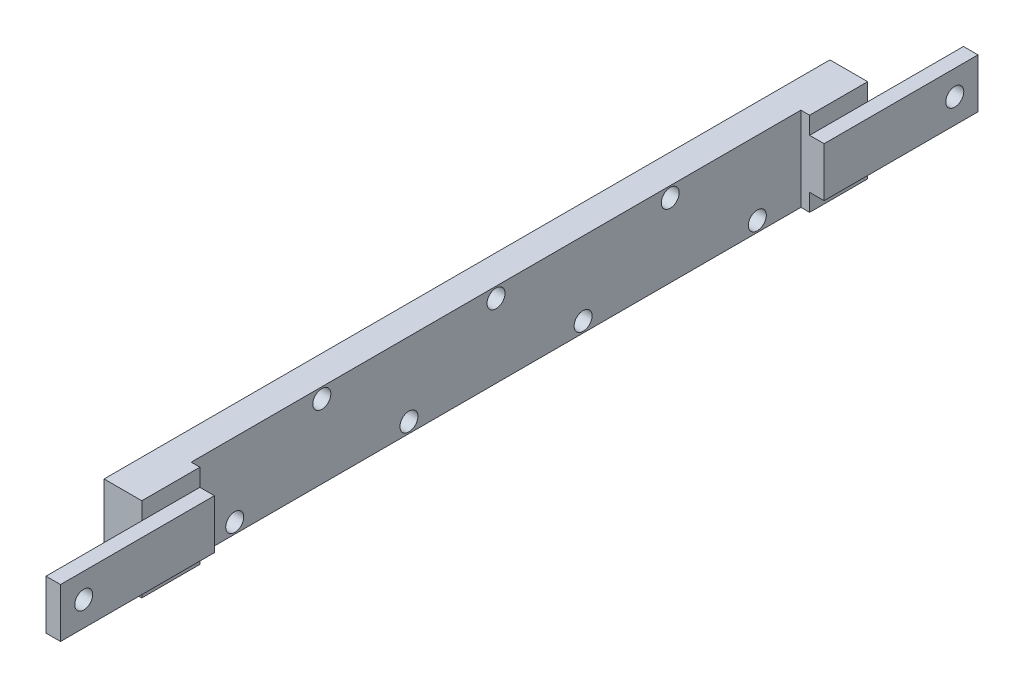
ISO-10303-21;
HEADER;
FILE_DESCRIPTION(('STEP AP214'),'2;1');
FILE_NAME('part.step','',(''),(''),'','','');
FILE_SCHEMA(('AUTOMOTIVE_DESIGN { 1 0 10303 214 1 1 1 1 }'));
ENDSEC;
DATA;
#1=APPLICATION_CONTEXT('core data for automotive mechanical design processes');
#2=APPLICATION_PROTOCOL_DEFINITION('international standard','automotive_design',2000,#1);
#3=PRODUCT_CONTEXT('',#1,'mechanical');
#4=PRODUCT('Part','Part','',(#3));
#5=PRODUCT_RELATED_PRODUCT_CATEGORY('part','',(#4));
#6=PRODUCT_DEFINITION_FORMATION('','',#4);
#7=PRODUCT_DEFINITION_CONTEXT('part definition',#1,'design');
#8=PRODUCT_DEFINITION('design','',#6,#7);
#9=PRODUCT_DEFINITION_SHAPE('','',#8);
#10=(LENGTH_UNIT() NAMED_UNIT(*) SI_UNIT(.MILLI.,.METRE.));
#11=(NAMED_UNIT(*) PLANE_ANGLE_UNIT() SI_UNIT($,.RADIAN.));
#12=(NAMED_UNIT(*) SI_UNIT($,.STERADIAN.) SOLID_ANGLE_UNIT());
#13=UNCERTAINTY_MEASURE_WITH_UNIT(LENGTH_MEASURE(1.E-05),#10,'distance_accuracy_value','');
#14=(GEOMETRIC_REPRESENTATION_CONTEXT(3) GLOBAL_UNCERTAINTY_ASSIGNED_CONTEXT((#13)) GLOBAL_UNIT_ASSIGNED_CONTEXT((#10,
#11,#12)) REPRESENTATION_CONTEXT('',''));
#15=CARTESIAN_POINT('',(0.,0.,0.));
#16=DIRECTION('',(0.,0.,1.));
#17=DIRECTION('',(1.,0.,0.));
#18=AXIS2_PLACEMENT_3D('',#15,#16,#17);
#19=CARTESIAN_POINT('',(13.,0.,0.));
#20=DIRECTION('',(-1.,0.,0.));
#21=DIRECTION('',(0.,0.,1.));
#22=AXIS2_PLACEMENT_3D('',#19,#20,#21);
#23=PLANE('',#22);
#24=DIRECTION('',(0.,0.,-1.));
#25=VECTOR('',#24,1.);
#26=CARTESIAN_POINT('',(13.,-8.5,-105.));
#27=LINE('',#26,#25);
#28=CARTESIAN_POINT('',(13.,-8.5,-105.));
#29=VERTEX_POINT('',#28);
#30=CARTESIAN_POINT('',(13.,-8.5,-125.));
#31=VERTEX_POINT('',#30);
#32=EDGE_CURVE('E346',#29,#31,#27,.T.);
#33=ORIENTED_EDGE('',*,*,#32,.F.);
#34=DIRECTION('',(0.,-1.,0.));
#35=VECTOR('',#34,1.);
#36=CARTESIAN_POINT('',(13.,14.5,-105.));
#37=LINE('',#36,#35);
#38=CARTESIAN_POINT('',(13.,-14.5,-105.));
#39=VERTEX_POINT('',#38);
#40=EDGE_CURVE('E219',#29,#39,#37,.T.);
#41=ORIENTED_EDGE('',*,*,#40,.T.);
#42=DIRECTION('',(0.,0.,-1.));
#43=VECTOR('',#42,1.);
#44=CARTESIAN_POINT('',(13.,-14.5,-105.));
#45=LINE('',#44,#43);
#46=CARTESIAN_POINT('',(13.,-14.5,-125.));
#47=VERTEX_POINT('',#46);
#48=EDGE_CURVE('E218',#39,#47,#45,.T.);
#49=ORIENTED_EDGE('',*,*,#48,.T.);
#50=DIRECTION('',(0.,-1.,0.));
#51=VECTOR('',#50,1.);
#52=CARTESIAN_POINT('',(13.,14.5,-125.));
#53=LINE('',#52,#51);
#54=EDGE_CURVE('E222',#31,#47,#53,.T.);
#55=ORIENTED_EDGE('',*,*,#54,.F.);
#56=EDGE_LOOP('',(#33,#41,#49,#55));
#57=FACE_BOUND('',#56,.T.);
#58=ADVANCED_FACE('F67',(#57),#23,.F.);
#59=CARTESIAN_POINT('',(13.,0.,0.));
#60=DIRECTION('',(-1.,0.,0.));
#61=DIRECTION('',(0.,0.,1.));
#62=AXIS2_PLACEMENT_3D('',#59,#60,#61);
#63=PLANE('',#62);
#64=DIRECTION('',(0.,0.,1.));
#65=VECTOR('',#64,1.);
#66=CARTESIAN_POINT('',(13.,8.5,105.));
#67=LINE('',#66,#65);
#68=CARTESIAN_POINT('',(13.,8.5,105.));
#69=VERTEX_POINT('',#68);
#70=CARTESIAN_POINT('',(13.,8.5,125.));
#71=VERTEX_POINT('',#70);
#72=EDGE_CURVE('E391',#69,#71,#67,.T.);
#73=ORIENTED_EDGE('',*,*,#72,.F.);
#74=DIRECTION('',(0.,-1.,0.));
#75=VECTOR('',#74,1.);
#76=CARTESIAN_POINT('',(13.,14.5,105.));
#77=LINE('',#76,#75);
#78=CARTESIAN_POINT('',(13.,14.5,105.));
#79=VERTEX_POINT('',#78);
#80=EDGE_CURVE('E238',#79,#69,#77,.T.);
#81=ORIENTED_EDGE('',*,*,#80,.F.);
#82=DIRECTION('',(0.,0.,-1.));
#83=VECTOR('',#82,1.);
#84=CARTESIAN_POINT('',(13.,14.5,125.));
#85=LINE('',#84,#83);
#86=CARTESIAN_POINT('',(13.,14.5,125.));
#87=VERTEX_POINT('',#86);
#88=EDGE_CURVE('E233',#87,#79,#85,.T.);
#89=ORIENTED_EDGE('',*,*,#88,.F.);
#90=DIRECTION('',(0.,-1.,0.));
#91=VECTOR('',#90,1.);
#92=CARTESIAN_POINT('',(13.,14.5,125.));
#93=LINE('',#92,#91);
#94=EDGE_CURVE('E245',#87,#71,#93,.T.);
#95=ORIENTED_EDGE('',*,*,#94,.T.);
#96=EDGE_LOOP('',(#73,#81,#89,#95));
#97=FACE_BOUND('',#96,.T.);
#98=ADVANCED_FACE('F379',(#97),#63,.F.);
#99=CARTESIAN_POINT('',(10.,0.,0.));
#100=DIRECTION('',(1.,0.,0.));
#101=DIRECTION('',(0.,0.,-1.));
#102=AXIS2_PLACEMENT_3D('',#99,#100,#101);
#103=PLANE('',#102);
#104=CARTESIAN_POINT('',(10.,-10.8586178819304,90.));
#105=DIRECTION('',(1.,0.,0.));
#106=DIRECTION('',(0.,0.,-1.));
#107=AXIS2_PLACEMENT_3D('',#104,#105,#106);
#108=CIRCLE('',#107,3.1);
#109=CARTESIAN_POINT('',(10.,-10.8586178819304,86.9));
#110=VERTEX_POINT('',#109);
#111=EDGE_CURVE('E256',#110,#110,#108,.T.);
#112=ORIENTED_EDGE('',*,*,#111,.F.);
#113=EDGE_LOOP('',(#112));
#114=FACE_BOUND('',#113,.T.);
#115=CARTESIAN_POINT('',(10.,10.8586178819304,60.));
#116=DIRECTION('',(1.,0.,0.));
#117=DIRECTION('',(0.,0.,-1.));
#118=AXIS2_PLACEMENT_3D('',#115,#116,#117);
#119=CIRCLE('',#118,3.1);
#120=CARTESIAN_POINT('',(10.,10.8586178819304,56.9));
#121=VERTEX_POINT('',#120);
#122=EDGE_CURVE('E254',#121,#121,#119,.T.);
#123=ORIENTED_EDGE('',*,*,#122,.F.);
#124=EDGE_LOOP('',(#123));
#125=FACE_BOUND('',#124,.T.);
#126=CARTESIAN_POINT('',(10.,10.8586178819304,0.));
#127=DIRECTION('',(1.,0.,0.));
#128=DIRECTION('',(0.,0.,-1.));
#129=AXIS2_PLACEMENT_3D('',#126,#127,#128);
#130=CIRCLE('',#129,3.1);
#131=CARTESIAN_POINT('',(10.,10.8586178819304,-3.10000000000001));
#132=VERTEX_POINT('',#131);
#133=EDGE_CURVE('E268',#132,#132,#130,.T.);
#134=ORIENTED_EDGE('',*,*,#133,.F.);
#135=EDGE_LOOP('',(#134));
#136=FACE_BOUND('',#135,.T.);
#137=CARTESIAN_POINT('',(10.,10.8586178819304,-60.));
#138=DIRECTION('',(1.,0.,0.));
#139=DIRECTION('',(0.,0.,-1.));
#140=AXIS2_PLACEMENT_3D('',#137,#138,#139);
#141=CIRCLE('',#140,3.1);
#142=CARTESIAN_POINT('',(10.,10.8586178819304,-63.1));
#143=VERTEX_POINT('',#142);
#144=EDGE_CURVE('E267',#143,#143,#141,.T.);
#145=ORIENTED_EDGE('',*,*,#144,.F.);
#146=EDGE_LOOP('',(#145));
#147=FACE_BOUND('',#146,.T.);
#148=CARTESIAN_POINT('',(10.,-10.8586178819304,-90.));
#149=DIRECTION('',(1.,0.,0.));
#150=DIRECTION('',(0.,0.,-1.));
#151=AXIS2_PLACEMENT_3D('',#148,#149,#150);
#152=CIRCLE('',#151,3.1);
#153=CARTESIAN_POINT('',(10.,-10.8586178819304,-93.1));
#154=VERTEX_POINT('',#153);
#155=EDGE_CURVE('E290',#154,#154,#152,.T.);
#156=ORIENTED_EDGE('',*,*,#155,.F.);
#157=EDGE_LOOP('',(#156));
#158=FACE_BOUND('',#157,.T.);
#159=CARTESIAN_POINT('',(10.,-10.8586178819304,-30.));
#160=DIRECTION('',(1.,0.,0.));
#161=DIRECTION('',(0.,0.,-1.));
#162=AXIS2_PLACEMENT_3D('',#159,#160,#161);
#163=CIRCLE('',#162,3.1);
#164=CARTESIAN_POINT('',(10.,-10.8586178819304,-33.1));
#165=VERTEX_POINT('',#164);
#166=EDGE_CURVE('E284',#165,#165,#163,.T.);
#167=ORIENTED_EDGE('',*,*,#166,.F.);
#168=EDGE_LOOP('',(#167));
#169=FACE_BOUND('',#168,.T.);
#170=CARTESIAN_POINT('',(10.,-10.8586178819304,30.));
#171=DIRECTION('',(1.,0.,0.));
#172=DIRECTION('',(0.,0.,-1.));
#173=AXIS2_PLACEMENT_3D('',#170,#171,#172);
#174=CIRCLE('',#173,3.1);
#175=CARTESIAN_POINT('',(10.,-10.8586178819304,26.9));
#176=VERTEX_POINT('',#175);
#177=EDGE_CURVE('E278',#176,#176,#174,.T.);
#178=ORIENTED_EDGE('',*,*,#177,.F.);
#179=EDGE_LOOP('',(#178));
#180=FACE_BOUND('',#179,.T.);
#181=DIRECTION('',(0.,0.,-1.));
#182=VECTOR('',#181,1.);
#183=CARTESIAN_POINT('',(10.,-14.5,125.));
#184=LINE('',#183,#182);
#185=CARTESIAN_POINT('',(10.,-14.5,105.));
#186=VERTEX_POINT('',#185);
#187=CARTESIAN_POINT('',(10.,-14.5,-105.));
#188=VERTEX_POINT('',#187);
#189=EDGE_CURVE('E298',#186,#188,#184,.T.);
#190=ORIENTED_EDGE('',*,*,#189,.T.);
#191=DIRECTION('',(0.,-1.,0.));
#192=VECTOR('',#191,1.);
#193=CARTESIAN_POINT('',(10.,14.5,-105.));
#194=LINE('',#193,#192);
#195=CARTESIAN_POINT('',(10.,14.5,-105.));
#196=VERTEX_POINT('',#195);
#197=EDGE_CURVE('E226',#196,#188,#194,.T.);
#198=ORIENTED_EDGE('',*,*,#197,.F.);
#199=DIRECTION('',(0.,0.,-1.));
#200=VECTOR('',#199,1.);
#201=CARTESIAN_POINT('',(10.,14.5,125.));
#202=LINE('',#201,#200);
#203=CARTESIAN_POINT('',(10.,14.5,105.));
#204=VERTEX_POINT('',#203);
#205=EDGE_CURVE('E301',#204,#196,#202,.T.);
#206=ORIENTED_EDGE('',*,*,#205,.F.);
#207=DIRECTION('',(0.,-1.,0.));
#208=VECTOR('',#207,1.);
#209=CARTESIAN_POINT('',(10.,14.5,105.));
#210=LINE('',#209,#208);
#211=EDGE_CURVE('E237',#204,#186,#210,.T.);
#212=ORIENTED_EDGE('',*,*,#211,.T.);
#213=EDGE_LOOP('',(#190,#198,#206,#212));
#214=FACE_BOUND('',#213,.T.);
#215=ADVANCED_FACE('F362',(#114,#125,#136,#147,#158,#169,#180,#214),#103,.T.);
#216=CARTESIAN_POINT('',(10.,14.5,125.));
#217=DIRECTION('',(0.,0.,-1.));
#218=DIRECTION('',(-1.,0.,0.));
#219=AXIS2_PLACEMENT_3D('',#216,#217,#218);
#220=PLANE('',#219);
#221=DIRECTION('',(0.,-1.,0.));
#222=VECTOR('',#221,1.);
#223=CARTESIAN_POINT('',(0.,14.5,125.));
#224=LINE('',#223,#222);
#225=CARTESIAN_POINT('',(0.,14.5,125.));
#226=VERTEX_POINT('',#225);
#227=CARTESIAN_POINT('',(0.,-14.5,125.));
#228=VERTEX_POINT('',#227);
#229=EDGE_CURVE('E259',#226,#228,#224,.T.);
#230=ORIENTED_EDGE('',*,*,#229,.T.);
#231=DIRECTION('',(-1.,0.,0.));
#232=VECTOR('',#231,1.);
#233=CARTESIAN_POINT('',(10.,-14.5,125.));
#234=LINE('',#233,#232);
#235=CARTESIAN_POINT('',(13.,-14.5,125.));
#236=VERTEX_POINT('',#235);
#237=EDGE_CURVE('E12',#236,#228,#234,.T.);
#238=ORIENTED_EDGE('',*,*,#237,.F.);
#239=CARTESIAN_POINT('',(13.,-8.49999999999999,125.));
#240=VERTEX_POINT('',#239);
#241=EDGE_CURVE('E244',#240,#236,#93,.T.);
#242=ORIENTED_EDGE('',*,*,#241,.F.);
#243=EDGE_CURVE('E249',#71,#240,#93,.T.);
#244=ORIENTED_EDGE('',*,*,#243,.F.);
#245=ORIENTED_EDGE('',*,*,#94,.F.);
#246=DIRECTION('',(-1.,0.,0.));
#247=VECTOR('',#246,1.);
#248=CARTESIAN_POINT('',(10.,14.5,125.));
#249=LINE('',#248,#247);
#250=EDGE_CURVE('E305',#87,#226,#249,.T.);
#251=ORIENTED_EDGE('',*,*,#250,.T.);
#252=EDGE_LOOP('',(#230,#238,#242,#244,#245,#251));
#253=FACE_BOUND('',#252,.T.);
#254=ADVANCED_FACE('F69',(#253),#220,.F.);
#255=CARTESIAN_POINT('',(10.,-14.5,125.));
#256=DIRECTION('',(0.,1.,0.));
#257=DIRECTION('',(0.,0.,1.));
#258=AXIS2_PLACEMENT_3D('',#255,#256,#257);
#259=PLANE('',#258);
#260=DIRECTION('',(0.,0.,-1.));
#261=VECTOR('',#260,1.);
#262=CARTESIAN_POINT('',(0.,-14.5,125.));
#263=LINE('',#262,#261);
#264=CARTESIAN_POINT('',(0.,-14.5,-125.));
#265=VERTEX_POINT('',#264);
#266=EDGE_CURVE('E308',#228,#265,#263,.T.);
#267=ORIENTED_EDGE('',*,*,#266,.T.);
#268=DIRECTION('',(-1.,0.,0.));
#269=VECTOR('',#268,1.);
#270=CARTESIAN_POINT('',(10.,-14.5,-125.));
#271=LINE('',#270,#269);
#272=EDGE_CURVE('E75',#47,#265,#271,.T.);
#273=ORIENTED_EDGE('',*,*,#272,.F.);
#274=ORIENTED_EDGE('',*,*,#48,.F.);
#275=DIRECTION('',(-1.,0.,0.));
#276=VECTOR('',#275,1.);
#277=CARTESIAN_POINT('',(13.,-14.5,-105.));
#278=LINE('',#277,#276);
#279=EDGE_CURVE('E224',#39,#188,#278,.T.);
#280=ORIENTED_EDGE('',*,*,#279,.T.);
#281=ORIENTED_EDGE('',*,*,#189,.F.);
#282=DIRECTION('',(-1.,0.,0.));
#283=VECTOR('',#282,1.);
#284=CARTESIAN_POINT('',(13.,-14.5,105.));
#285=LINE('',#284,#283);
#286=CARTESIAN_POINT('',(13.,-14.5,105.));
#287=VERTEX_POINT('',#286);
#288=EDGE_CURVE('E252',#287,#186,#285,.T.);
#289=ORIENTED_EDGE('',*,*,#288,.F.);
#290=DIRECTION('',(0.,0.,-1.));
#291=VECTOR('',#290,1.);
#292=CARTESIAN_POINT('',(13.,-14.5,125.));
#293=LINE('',#292,#291);
#294=EDGE_CURVE('E241',#236,#287,#293,.T.);
#295=ORIENTED_EDGE('',*,*,#294,.F.);
#296=ORIENTED_EDGE('',*,*,#237,.T.);
#297=EDGE_LOOP('',(#267,#273,#274,#280,#281,#289,#295,#296));
#298=FACE_BOUND('',#297,.T.);
#299=ADVANCED_FACE('F326',(#298),#259,.F.);
#300=CARTESIAN_POINT('',(10.,14.5,-125.));
#301=DIRECTION('',(0.,0.,-1.));
#302=DIRECTION('',(-1.,0.,0.));
#303=AXIS2_PLACEMENT_3D('',#300,#301,#302);
#304=PLANE('',#303);
#305=DIRECTION('',(0.,-1.,0.));
#306=VECTOR('',#305,1.);
#307=CARTESIAN_POINT('',(0.,14.5,-125.));
#308=LINE('',#307,#306);
#309=CARTESIAN_POINT('',(0.,14.5,-125.));
#310=VERTEX_POINT('',#309);
#311=EDGE_CURVE('E311',#310,#265,#308,.T.);
#312=ORIENTED_EDGE('',*,*,#311,.F.);
#313=DIRECTION('',(-1.,0.,0.));
#314=VECTOR('',#313,1.);
#315=CARTESIAN_POINT('',(10.,14.5,-125.));
#316=LINE('',#315,#314);
#317=CARTESIAN_POINT('',(13.,14.5,-125.));
#318=VERTEX_POINT('',#317);
#319=EDGE_CURVE('E317',#318,#310,#316,.T.);
#320=ORIENTED_EDGE('',*,*,#319,.F.);
#321=CARTESIAN_POINT('',(13.,8.5,-125.));
#322=VERTEX_POINT('',#321);
#323=EDGE_CURVE('E229',#318,#322,#53,.T.);
#324=ORIENTED_EDGE('',*,*,#323,.T.);
#325=EDGE_CURVE('E231',#322,#31,#53,.T.);
#326=ORIENTED_EDGE('',*,*,#325,.T.);
#327=ORIENTED_EDGE('',*,*,#54,.T.);
#328=ORIENTED_EDGE('',*,*,#272,.T.);
#329=EDGE_LOOP('',(#312,#320,#324,#326,#327,#328));
#330=FACE_BOUND('',#329,.T.);
#331=ADVANCED_FACE('F321',(#330),#304,.T.);
#332=CARTESIAN_POINT('',(10.,14.5,125.));
#333=DIRECTION('',(0.,1.,0.));
#334=DIRECTION('',(0.,0.,1.));
#335=AXIS2_PLACEMENT_3D('',#332,#333,#334);
#336=PLANE('',#335);
#337=DIRECTION('',(0.,0.,-1.));
#338=VECTOR('',#337,1.);
#339=CARTESIAN_POINT('',(0.,14.5,125.));
#340=LINE('',#339,#338);
#341=EDGE_CURVE('E302',#226,#310,#340,.T.);
#342=ORIENTED_EDGE('',*,*,#341,.F.);
#343=ORIENTED_EDGE('',*,*,#250,.F.);
#344=ORIENTED_EDGE('',*,*,#88,.T.);
#345=DIRECTION('',(-1.,0.,0.));
#346=VECTOR('',#345,1.);
#347=CARTESIAN_POINT('',(13.,14.5,105.));
#348=LINE('',#347,#346);
#349=EDGE_CURVE('E248',#79,#204,#348,.T.);
#350=ORIENTED_EDGE('',*,*,#349,.T.);
#351=ORIENTED_EDGE('',*,*,#205,.T.);
#352=DIRECTION('',(-1.,0.,0.));
#353=VECTOR('',#352,1.);
#354=CARTESIAN_POINT('',(13.,14.5,-105.));
#355=LINE('',#354,#353);
#356=CARTESIAN_POINT('',(13.,14.5,-105.));
#357=VERTEX_POINT('',#356);
#358=EDGE_CURVE('E358',#357,#196,#355,.T.);
#359=ORIENTED_EDGE('',*,*,#358,.F.);
#360=DIRECTION('',(0.,0.,-1.));
#361=VECTOR('',#360,1.);
#362=CARTESIAN_POINT('',(13.,14.5,-105.));
#363=LINE('',#362,#361);
#364=EDGE_CURVE('E217',#357,#318,#363,.T.);
#365=ORIENTED_EDGE('',*,*,#364,.T.);
#366=ORIENTED_EDGE('',*,*,#319,.T.);
#367=EDGE_LOOP('',(#342,#343,#344,#350,#351,#359,#365,#366));
#368=FACE_BOUND('',#367,.T.);
#369=ADVANCED_FACE('F334',(#368),#336,.T.);
#370=CARTESIAN_POINT('',(0.,0.,0.));
#371=DIRECTION('',(1.,0.,0.));
#372=DIRECTION('',(0.,0.,-1.));
#373=AXIS2_PLACEMENT_3D('',#370,#371,#372);
#374=PLANE('',#373);
#375=CARTESIAN_POINT('',(0.,-10.8586178819304,90.));
#376=DIRECTION('',(1.,0.,0.));
#377=DIRECTION('',(0.,0.,-1.));
#378=AXIS2_PLACEMENT_3D('',#375,#376,#377);
#379=CIRCLE('',#378,3.1);
#380=CARTESIAN_POINT('',(0.,-10.8586178819304,86.9));
#381=VERTEX_POINT('',#380);
#382=EDGE_CURVE('E260',#381,#381,#379,.T.);
#383=ORIENTED_EDGE('',*,*,#382,.T.);
#384=EDGE_LOOP('',(#383));
#385=FACE_BOUND('',#384,.T.);
#386=CARTESIAN_POINT('',(0.,10.8586178819304,60.));
#387=DIRECTION('',(1.,0.,0.));
#388=DIRECTION('',(0.,0.,-1.));
#389=AXIS2_PLACEMENT_3D('',#386,#387,#388);
#390=CIRCLE('',#389,3.1);
#391=CARTESIAN_POINT('',(0.,10.8586178819304,56.9));
#392=VERTEX_POINT('',#391);
#393=EDGE_CURVE('E271',#392,#392,#390,.T.);
#394=ORIENTED_EDGE('',*,*,#393,.T.);
#395=EDGE_LOOP('',(#394));
#396=FACE_BOUND('',#395,.T.);
#397=CARTESIAN_POINT('',(0.,10.8586178819304,0.));
#398=DIRECTION('',(1.,0.,0.));
#399=DIRECTION('',(0.,0.,-1.));
#400=AXIS2_PLACEMENT_3D('',#397,#398,#399);
#401=CIRCLE('',#400,3.1);
#402=CARTESIAN_POINT('',(0.,10.8586178819304,-3.10000000000001));
#403=VERTEX_POINT('',#402);
#404=EDGE_CURVE('E264',#403,#403,#401,.T.);
#405=ORIENTED_EDGE('',*,*,#404,.T.);
#406=EDGE_LOOP('',(#405));
#407=FACE_BOUND('',#406,.T.);
#408=CARTESIAN_POINT('',(0.,10.8586178819304,-60.));
#409=DIRECTION('',(1.,0.,0.));
#410=DIRECTION('',(0.,0.,-1.));
#411=AXIS2_PLACEMENT_3D('',#408,#409,#410);
#412=CIRCLE('',#411,3.1);
#413=CARTESIAN_POINT('',(0.,10.8586178819304,-63.1));
#414=VERTEX_POINT('',#413);
#415=EDGE_CURVE('E293',#414,#414,#412,.T.);
#416=ORIENTED_EDGE('',*,*,#415,.T.);
#417=EDGE_LOOP('',(#416));
#418=FACE_BOUND('',#417,.T.);
#419=CARTESIAN_POINT('',(0.,-10.8586178819304,-90.));
#420=DIRECTION('',(1.,0.,0.));
#421=DIRECTION('',(0.,0.,-1.));
#422=AXIS2_PLACEMENT_3D('',#419,#420,#421);
#423=CIRCLE('',#422,3.1);
#424=CARTESIAN_POINT('',(0.,-10.8586178819304,-93.1));
#425=VERTEX_POINT('',#424);
#426=EDGE_CURVE('E287',#425,#425,#423,.T.);
#427=ORIENTED_EDGE('',*,*,#426,.T.);
#428=EDGE_LOOP('',(#427));
#429=FACE_BOUND('',#428,.T.);
#430=CARTESIAN_POINT('',(0.,-10.8586178819304,-30.));
#431=DIRECTION('',(1.,0.,0.));
#432=DIRECTION('',(0.,0.,-1.));
#433=AXIS2_PLACEMENT_3D('',#430,#431,#432);
#434=CIRCLE('',#433,3.1);
#435=CARTESIAN_POINT('',(0.,-10.8586178819304,-33.1));
#436=VERTEX_POINT('',#435);
#437=EDGE_CURVE('E281',#436,#436,#434,.T.);
#438=ORIENTED_EDGE('',*,*,#437,.T.);
#439=EDGE_LOOP('',(#438));
#440=FACE_BOUND('',#439,.T.);
#441=CARTESIAN_POINT('',(0.,-10.8586178819304,30.));
#442=DIRECTION('',(1.,0.,0.));
#443=DIRECTION('',(0.,0.,-1.));
#444=AXIS2_PLACEMENT_3D('',#441,#442,#443);
#445=CIRCLE('',#444,3.1);
#446=CARTESIAN_POINT('',(0.,-10.8586178819304,26.9));
#447=VERTEX_POINT('',#446);
#448=EDGE_CURVE('E263',#447,#447,#445,.T.);
#449=ORIENTED_EDGE('',*,*,#448,.T.);
#450=EDGE_LOOP('',(#449));
#451=FACE_BOUND('',#450,.T.);
#452=ORIENTED_EDGE('',*,*,#229,.F.);
#453=ORIENTED_EDGE('',*,*,#341,.T.);
#454=ORIENTED_EDGE('',*,*,#311,.T.);
#455=ORIENTED_EDGE('',*,*,#266,.F.);
#456=EDGE_LOOP('',(#452,#453,#454,#455));
#457=FACE_BOUND('',#456,.T.);
#458=ADVANCED_FACE('F331',(#385,#396,#407,#418,#429,#440,#451,#457),#374,.F.);
#459=CARTESIAN_POINT('',(10.,-10.8586178819304,30.));
#460=DIRECTION('',(-1.,0.,0.));
#461=DIRECTION('',(0.,0.,1.));
#462=AXIS2_PLACEMENT_3D('',#459,#460,#461);
#463=CYLINDRICAL_SURFACE('',#462,3.1);
#464=ORIENTED_EDGE('',*,*,#177,.T.);
#465=EDGE_LOOP('',(#464));
#466=FACE_BOUND('',#465,.T.);
#467=ORIENTED_EDGE('',*,*,#448,.F.);
#468=EDGE_LOOP('',(#467));
#469=FACE_BOUND('',#468,.T.);
#470=ADVANCED_FACE('F705',(#466,#469),#463,.F.);
#471=CARTESIAN_POINT('',(10.,-10.8586178819304,-30.));
#472=DIRECTION('',(-1.,0.,0.));
#473=DIRECTION('',(0.,0.,1.));
#474=AXIS2_PLACEMENT_3D('',#471,#472,#473);
#475=CYLINDRICAL_SURFACE('',#474,3.1);
#476=ORIENTED_EDGE('',*,*,#166,.T.);
#477=EDGE_LOOP('',(#476));
#478=FACE_BOUND('',#477,.T.);
#479=ORIENTED_EDGE('',*,*,#437,.F.);
#480=EDGE_LOOP('',(#479));
#481=FACE_BOUND('',#480,.T.);
#482=ADVANCED_FACE('F695',(#478,#481),#475,.F.);
#483=CARTESIAN_POINT('',(10.,-10.8586178819304,-90.));
#484=DIRECTION('',(-1.,0.,0.));
#485=DIRECTION('',(0.,0.,1.));
#486=AXIS2_PLACEMENT_3D('',#483,#484,#485);
#487=CYLINDRICAL_SURFACE('',#486,3.1);
#488=ORIENTED_EDGE('',*,*,#155,.T.);
#489=EDGE_LOOP('',(#488));
#490=FACE_BOUND('',#489,.T.);
#491=ORIENTED_EDGE('',*,*,#426,.F.);
#492=EDGE_LOOP('',(#491));
#493=FACE_BOUND('',#492,.T.);
#494=ADVANCED_FACE('F685',(#490,#493),#487,.F.);
#495=CARTESIAN_POINT('',(10.,10.8586178819304,-60.));
#496=DIRECTION('',(-1.,0.,0.));
#497=DIRECTION('',(0.,0.,1.));
#498=AXIS2_PLACEMENT_3D('',#495,#496,#497);
#499=CYLINDRICAL_SURFACE('',#498,3.1);
#500=ORIENTED_EDGE('',*,*,#144,.T.);
#501=EDGE_LOOP('',(#500));
#502=FACE_BOUND('',#501,.T.);
#503=ORIENTED_EDGE('',*,*,#415,.F.);
#504=EDGE_LOOP('',(#503));
#505=FACE_BOUND('',#504,.T.);
#506=ADVANCED_FACE('F675',(#502,#505),#499,.F.);
#507=CARTESIAN_POINT('',(10.,10.8586178819304,0.));
#508=DIRECTION('',(-1.,0.,0.));
#509=DIRECTION('',(0.,0.,1.));
#510=AXIS2_PLACEMENT_3D('',#507,#508,#509);
#511=CYLINDRICAL_SURFACE('',#510,3.1);
#512=ORIENTED_EDGE('',*,*,#133,.T.);
#513=EDGE_LOOP('',(#512));
#514=FACE_BOUND('',#513,.T.);
#515=ORIENTED_EDGE('',*,*,#404,.F.);
#516=EDGE_LOOP('',(#515));
#517=FACE_BOUND('',#516,.T.);
#518=ADVANCED_FACE('F665',(#514,#517),#511,.F.);
#519=CARTESIAN_POINT('',(10.,10.8586178819304,60.));
#520=DIRECTION('',(-1.,0.,0.));
#521=DIRECTION('',(0.,0.,1.));
#522=AXIS2_PLACEMENT_3D('',#519,#520,#521);
#523=CYLINDRICAL_SURFACE('',#522,3.1);
#524=ORIENTED_EDGE('',*,*,#122,.T.);
#525=EDGE_LOOP('',(#524));
#526=FACE_BOUND('',#525,.T.);
#527=ORIENTED_EDGE('',*,*,#393,.F.);
#528=EDGE_LOOP('',(#527));
#529=FACE_BOUND('',#528,.T.);
#530=ADVANCED_FACE('F655',(#526,#529),#523,.F.);
#531=CARTESIAN_POINT('',(10.,-10.8586178819304,90.));
#532=DIRECTION('',(-1.,0.,0.));
#533=DIRECTION('',(0.,0.,1.));
#534=AXIS2_PLACEMENT_3D('',#531,#532,#533);
#535=CYLINDRICAL_SURFACE('',#534,3.1);
#536=ORIENTED_EDGE('',*,*,#111,.T.);
#537=EDGE_LOOP('',(#536));
#538=FACE_BOUND('',#537,.T.);
#539=ORIENTED_EDGE('',*,*,#382,.F.);
#540=EDGE_LOOP('',(#539));
#541=FACE_BOUND('',#540,.T.);
#542=ADVANCED_FACE('F588',(#538,#541),#535,.F.);
#543=CARTESIAN_POINT('',(13.,14.5,105.));
#544=DIRECTION('',(0.,0.,-1.));
#545=DIRECTION('',(-1.,0.,0.));
#546=AXIS2_PLACEMENT_3D('',#543,#544,#545);
#547=PLANE('',#546);
#548=ORIENTED_EDGE('',*,*,#211,.F.);
#549=ORIENTED_EDGE('',*,*,#349,.F.);
#550=ORIENTED_EDGE('',*,*,#80,.T.);
#551=DIRECTION('',(-1.,0.,0.));
#552=VECTOR('',#551,1.);
#553=CARTESIAN_POINT('',(18.,8.5,105.));
#554=LINE('',#553,#552);
#555=CARTESIAN_POINT('',(18.,8.5,105.));
#556=VERTEX_POINT('',#555);
#557=EDGE_CURVE('E380',#556,#69,#554,.T.);
#558=ORIENTED_EDGE('',*,*,#557,.F.);
#559=DIRECTION('',(0.,-1.,0.));
#560=VECTOR('',#559,1.);
#561=CARTESIAN_POINT('',(18.,8.5,105.));
#562=LINE('',#561,#560);
#563=CARTESIAN_POINT('',(18.,-8.5,105.));
#564=VERTEX_POINT('',#563);
#565=EDGE_CURVE('E394',#556,#564,#562,.T.);
#566=ORIENTED_EDGE('',*,*,#565,.T.);
#567=DIRECTION('',(-1.,0.,0.));
#568=VECTOR('',#567,1.);
#569=CARTESIAN_POINT('',(18.,-8.5,105.));
#570=LINE('',#569,#568);
#571=CARTESIAN_POINT('',(13.,-8.5,105.));
#572=VERTEX_POINT('',#571);
#573=EDGE_CURVE('E384',#564,#572,#570,.T.);
#574=ORIENTED_EDGE('',*,*,#573,.T.);
#575=EDGE_CURVE('E236',#572,#287,#77,.T.);
#576=ORIENTED_EDGE('',*,*,#575,.T.);
#577=ORIENTED_EDGE('',*,*,#288,.T.);
#578=EDGE_LOOP('',(#548,#549,#550,#558,#566,#574,#576,#577));
#579=FACE_BOUND('',#578,.T.);
#580=ADVANCED_FACE('F366',(#579),#547,.T.);
#581=ORIENTED_EDGE('',*,*,#575,.F.);
#582=DIRECTION('',(0.,0.,1.));
#583=VECTOR('',#582,1.);
#584=CARTESIAN_POINT('',(13.,-8.5,105.));
#585=LINE('',#584,#583);
#586=EDGE_CURVE('E373',#572,#240,#585,.T.);
#587=ORIENTED_EDGE('',*,*,#586,.T.);
#588=ORIENTED_EDGE('',*,*,#241,.T.);
#589=ORIENTED_EDGE('',*,*,#294,.T.);
#590=EDGE_LOOP('',(#581,#587,#588,#589));
#591=FACE_BOUND('',#590,.T.);
#592=ADVANCED_FACE('F370',(#591),#63,.F.);
#593=CARTESIAN_POINT('',(13.,14.5,-105.));
#594=DIRECTION('',(0.,0.,-1.));
#595=DIRECTION('',(-1.,0.,0.));
#596=AXIS2_PLACEMENT_3D('',#593,#594,#595);
#597=PLANE('',#596);
#598=ORIENTED_EDGE('',*,*,#197,.T.);
#599=ORIENTED_EDGE('',*,*,#279,.F.);
#600=ORIENTED_EDGE('',*,*,#40,.F.);
#601=DIRECTION('',(-1.,0.,0.));
#602=VECTOR('',#601,1.);
#603=CARTESIAN_POINT('',(18.,-8.5,-105.));
#604=LINE('',#603,#602);
#605=CARTESIAN_POINT('',(18.,-8.5,-105.));
#606=VERTEX_POINT('',#605);
#607=EDGE_CURVE('E350',#606,#29,#604,.T.);
#608=ORIENTED_EDGE('',*,*,#607,.F.);
#609=DIRECTION('',(0.,-1.,0.));
#610=VECTOR('',#609,1.);
#611=CARTESIAN_POINT('',(18.,8.5,-105.));
#612=LINE('',#611,#610);
#613=CARTESIAN_POINT('',(18.,8.5,-105.));
#614=VERTEX_POINT('',#613);
#615=EDGE_CURVE('E201',#614,#606,#612,.T.);
#616=ORIENTED_EDGE('',*,*,#615,.F.);
#617=DIRECTION('',(-1.,0.,0.));
#618=VECTOR('',#617,1.);
#619=CARTESIAN_POINT('',(18.,8.5,-105.));
#620=LINE('',#619,#618);
#621=CARTESIAN_POINT('',(13.,8.5,-105.));
#622=VERTEX_POINT('',#621);
#623=EDGE_CURVE('E194',#614,#622,#620,.T.);
#624=ORIENTED_EDGE('',*,*,#623,.T.);
#625=EDGE_CURVE('E197',#357,#622,#37,.T.);
#626=ORIENTED_EDGE('',*,*,#625,.F.);
#627=ORIENTED_EDGE('',*,*,#358,.T.);
#628=EDGE_LOOP('',(#598,#599,#600,#608,#616,#624,#626,#627));
#629=FACE_BOUND('',#628,.T.);
#630=ADVANCED_FACE('F195',(#629),#597,.F.);
#631=ORIENTED_EDGE('',*,*,#625,.T.);
#632=DIRECTION('',(0.,0.,-1.));
#633=VECTOR('',#632,1.);
#634=CARTESIAN_POINT('',(13.,8.5,-105.));
#635=LINE('',#634,#633);
#636=EDGE_CURVE('E208',#622,#322,#635,.T.);
#637=ORIENTED_EDGE('',*,*,#636,.T.);
#638=ORIENTED_EDGE('',*,*,#323,.F.);
#639=ORIENTED_EDGE('',*,*,#364,.F.);
#640=EDGE_LOOP('',(#631,#637,#638,#639));
#641=FACE_BOUND('',#640,.T.);
#642=ADVANCED_FACE('F215',(#641),#23,.F.);
#643=CARTESIAN_POINT('',(13.,0.,0.));
#644=DIRECTION('',(-1.,0.,0.));
#645=DIRECTION('',(0.,0.,1.));
#646=AXIS2_PLACEMENT_3D('',#643,#644,#645);
#647=PLANE('',#646);
#648=CARTESIAN_POINT('',(13.,0.,150.));
#649=DIRECTION('',(1.,0.,0.));
#650=DIRECTION('',(0.,0.,-1.));
#651=AXIS2_PLACEMENT_3D('',#648,#649,#650);
#652=CIRCLE('',#651,3.09999999999999);
#653=CARTESIAN_POINT('',(13.,0.,146.9));
#654=VERTEX_POINT('',#653);
#655=EDGE_CURVE('E408',#654,#654,#652,.T.);
#656=ORIENTED_EDGE('',*,*,#655,.T.);
#657=EDGE_LOOP('',(#656));
#658=FACE_BOUND('',#657,.T.);
#659=ORIENTED_EDGE('',*,*,#243,.T.);
#660=CARTESIAN_POINT('',(13.,-8.50000000000001,158.));
#661=VERTEX_POINT('',#660);
#662=EDGE_CURVE('E90',#240,#661,#585,.T.);
#663=ORIENTED_EDGE('',*,*,#662,.T.);
#664=DIRECTION('',(0.,-1.,0.));
#665=VECTOR('',#664,1.);
#666=CARTESIAN_POINT('',(13.,8.49999999999999,158.));
#667=LINE('',#666,#665);
#668=CARTESIAN_POINT('',(13.,8.49999999999999,158.));
#669=VERTEX_POINT('',#668);
#670=EDGE_CURVE('E396',#669,#661,#667,.T.);
#671=ORIENTED_EDGE('',*,*,#670,.F.);
#672=EDGE_CURVE('E395',#71,#669,#67,.T.);
#673=ORIENTED_EDGE('',*,*,#672,.F.);
#674=EDGE_LOOP('',(#659,#663,#671,#673));
#675=FACE_BOUND('',#674,.T.);
#676=ADVANCED_FACE('F462',(#658,#675),#647,.T.);
#677=CARTESIAN_POINT('',(18.,0.,0.));
#678=DIRECTION('',(-1.,0.,0.));
#679=DIRECTION('',(0.,0.,1.));
#680=AXIS2_PLACEMENT_3D('',#677,#678,#679);
#681=PLANE('',#680);
#682=ORIENTED_EDGE('',*,*,#565,.F.);
#683=DIRECTION('',(0.,0.,1.));
#684=VECTOR('',#683,1.);
#685=CARTESIAN_POINT('',(18.,8.5,105.));
#686=LINE('',#685,#684);
#687=CARTESIAN_POINT('',(18.,8.49999999999999,158.));
#688=VERTEX_POINT('',#687);
#689=EDGE_CURVE('E387',#556,#688,#686,.T.);
#690=ORIENTED_EDGE('',*,*,#689,.T.);
#691=DIRECTION('',(0.,-1.,0.));
#692=VECTOR('',#691,1.);
#693=CARTESIAN_POINT('',(18.,8.49999999999999,158.));
#694=LINE('',#693,#692);
#695=CARTESIAN_POINT('',(18.,-8.50000000000001,158.));
#696=VERTEX_POINT('',#695);
#697=EDGE_CURVE('E401',#688,#696,#694,.T.);
#698=ORIENTED_EDGE('',*,*,#697,.T.);
#699=DIRECTION('',(0.,0.,1.));
#700=VECTOR('',#699,1.);
#701=CARTESIAN_POINT('',(18.,-8.5,105.));
#702=LINE('',#701,#700);
#703=EDGE_CURVE('E403',#564,#696,#702,.T.);
#704=ORIENTED_EDGE('',*,*,#703,.F.);
#705=EDGE_LOOP('',(#682,#690,#698,#704));
#706=FACE_BOUND('',#705,.T.);
#707=CARTESIAN_POINT('',(18.,0.,150.));
#708=DIRECTION('',(1.,0.,0.));
#709=DIRECTION('',(0.,0.,-1.));
#710=AXIS2_PLACEMENT_3D('',#707,#708,#709);
#711=CIRCLE('',#710,3.09999999999999);
#712=CARTESIAN_POINT('',(18.,0.,146.9));
#713=VERTEX_POINT('',#712);
#714=EDGE_CURVE('E411',#713,#713,#711,.T.);
#715=ORIENTED_EDGE('',*,*,#714,.F.);
#716=EDGE_LOOP('',(#715));
#717=FACE_BOUND('',#716,.T.);
#718=ADVANCED_FACE('F467',(#706,#717),#681,.F.);
#719=CARTESIAN_POINT('',(18.,8.5,105.));
#720=DIRECTION('',(0.,-1.,0.));
#721=DIRECTION('',(0.,0.,-1.));
#722=AXIS2_PLACEMENT_3D('',#719,#720,#721);
#723=PLANE('',#722);
#724=ORIENTED_EDGE('',*,*,#72,.T.);
#725=ORIENTED_EDGE('',*,*,#672,.T.);
#726=DIRECTION('',(-1.,0.,0.));
#727=VECTOR('',#726,1.);
#728=CARTESIAN_POINT('',(18.,8.49999999999999,158.));
#729=LINE('',#728,#727);
#730=EDGE_CURVE('E381',#688,#669,#729,.T.);
#731=ORIENTED_EDGE('',*,*,#730,.F.);
#732=ORIENTED_EDGE('',*,*,#689,.F.);
#733=ORIENTED_EDGE('',*,*,#557,.T.);
#734=EDGE_LOOP('',(#724,#725,#731,#732,#733));
#735=FACE_BOUND('',#734,.T.);
#736=ADVANCED_FACE('F480',(#735),#723,.F.);
#737=CARTESIAN_POINT('',(18.,8.49999999999999,158.));
#738=DIRECTION('',(0.,0.,-1.));
#739=DIRECTION('',(-1.,0.,0.));
#740=AXIS2_PLACEMENT_3D('',#737,#738,#739);
#741=PLANE('',#740);
#742=ORIENTED_EDGE('',*,*,#670,.T.);
#743=DIRECTION('',(-1.,0.,0.));
#744=VECTOR('',#743,1.);
#745=CARTESIAN_POINT('',(18.,-8.50000000000001,158.));
#746=LINE('',#745,#744);
#747=EDGE_CURVE('E386',#696,#661,#746,.T.);
#748=ORIENTED_EDGE('',*,*,#747,.F.);
#749=ORIENTED_EDGE('',*,*,#697,.F.);
#750=ORIENTED_EDGE('',*,*,#730,.T.);
#751=EDGE_LOOP('',(#742,#748,#749,#750));
#752=FACE_BOUND('',#751,.T.);
#753=ADVANCED_FACE('F477',(#752),#741,.F.);
#754=CARTESIAN_POINT('',(18.,-8.5,105.));
#755=DIRECTION('',(0.,-1.,0.));
#756=DIRECTION('',(0.,0.,-1.));
#757=AXIS2_PLACEMENT_3D('',#754,#755,#756);
#758=PLANE('',#757);
#759=ORIENTED_EDGE('',*,*,#586,.F.);
#760=ORIENTED_EDGE('',*,*,#573,.F.);
#761=ORIENTED_EDGE('',*,*,#703,.T.);
#762=ORIENTED_EDGE('',*,*,#747,.T.);
#763=ORIENTED_EDGE('',*,*,#662,.F.);
#764=EDGE_LOOP('',(#759,#760,#761,#762,#763));
#765=FACE_BOUND('',#764,.T.);
#766=ADVANCED_FACE('F474',(#765),#758,.T.);
#767=CARTESIAN_POINT('',(18.,0.,150.));
#768=DIRECTION('',(-1.,0.,0.));
#769=DIRECTION('',(0.,0.,1.));
#770=AXIS2_PLACEMENT_3D('',#767,#768,#769);
#771=CYLINDRICAL_SURFACE('',#770,3.09999999999999);
#772=ORIENTED_EDGE('',*,*,#714,.T.);
#773=EDGE_LOOP('',(#772));
#774=FACE_BOUND('',#773,.T.);
#775=ORIENTED_EDGE('',*,*,#655,.F.);
#776=EDGE_LOOP('',(#775));
#777=FACE_BOUND('',#776,.T.);
#778=ADVANCED_FACE('F437',(#774,#777),#771,.F.);
#779=CARTESIAN_POINT('',(18.,0.,0.));
#780=DIRECTION('',(1.,0.,0.));
#781=DIRECTION('',(0.,0.,-1.));
#782=AXIS2_PLACEMENT_3D('',#779,#780,#781);
#783=PLANE('',#782);
#784=ORIENTED_EDGE('',*,*,#615,.T.);
#785=DIRECTION('',(0.,0.,-1.));
#786=VECTOR('',#785,1.);
#787=CARTESIAN_POINT('',(18.,-8.5,-105.));
#788=LINE('',#787,#786);
#789=CARTESIAN_POINT('',(18.,-8.5,-158.));
#790=VERTEX_POINT('',#789);
#791=EDGE_CURVE('E420',#606,#790,#788,.T.);
#792=ORIENTED_EDGE('',*,*,#791,.T.);
#793=DIRECTION('',(0.,-1.,0.));
#794=VECTOR('',#793,1.);
#795=CARTESIAN_POINT('',(18.,8.5,-158.));
#796=LINE('',#795,#794);
#797=CARTESIAN_POINT('',(18.,8.5,-158.));
#798=VERTEX_POINT('',#797);
#799=EDGE_CURVE('E422',#798,#790,#796,.T.);
#800=ORIENTED_EDGE('',*,*,#799,.F.);
#801=DIRECTION('',(0.,0.,-1.));
#802=VECTOR('',#801,1.);
#803=CARTESIAN_POINT('',(18.,8.5,-105.));
#804=LINE('',#803,#802);
#805=EDGE_CURVE('E204',#614,#798,#804,.T.);
#806=ORIENTED_EDGE('',*,*,#805,.F.);
#807=EDGE_LOOP('',(#784,#792,#800,#806));
#808=FACE_BOUND('',#807,.T.);
#809=CARTESIAN_POINT('',(18.,0.,-150.));
#810=DIRECTION('',(1.,0.,0.));
#811=DIRECTION('',(0.,0.,-1.));
#812=AXIS2_PLACEMENT_3D('',#809,#810,#811);
#813=CIRCLE('',#812,3.09999999999999);
#814=CARTESIAN_POINT('',(18.,0.,-153.1));
#815=VERTEX_POINT('',#814);
#816=EDGE_CURVE('E353',#815,#815,#813,.T.);
#817=ORIENTED_EDGE('',*,*,#816,.F.);
#818=EDGE_LOOP('',(#817));
#819=FACE_BOUND('',#818,.T.);
#820=ADVANCED_FACE('F434',(#808,#819),#783,.T.);
#821=CARTESIAN_POINT('',(13.,0.,0.));
#822=DIRECTION('',(1.,0.,0.));
#823=DIRECTION('',(0.,0.,-1.));
#824=AXIS2_PLACEMENT_3D('',#821,#822,#823);
#825=PLANE('',#824);
#826=ORIENTED_EDGE('',*,*,#325,.F.);
#827=CARTESIAN_POINT('',(13.,8.5,-158.));
#828=VERTEX_POINT('',#827);
#829=EDGE_CURVE('E82',#322,#828,#635,.T.);
#830=ORIENTED_EDGE('',*,*,#829,.T.);
#831=DIRECTION('',(0.,-1.,0.));
#832=VECTOR('',#831,1.);
#833=CARTESIAN_POINT('',(13.,8.5,-158.));
#834=LINE('',#833,#832);
#835=CARTESIAN_POINT('',(13.,-8.5,-158.));
#836=VERTEX_POINT('',#835);
#837=EDGE_CURVE('E213',#828,#836,#834,.T.);
#838=ORIENTED_EDGE('',*,*,#837,.T.);
#839=EDGE_CURVE('E340',#31,#836,#27,.T.);
#840=ORIENTED_EDGE('',*,*,#839,.F.);
#841=EDGE_LOOP('',(#826,#830,#838,#840));
#842=FACE_BOUND('',#841,.T.);
#843=CARTESIAN_POINT('',(13.,0.,-150.));
#844=DIRECTION('',(1.,0.,0.));
#845=DIRECTION('',(0.,0.,-1.));
#846=AXIS2_PLACEMENT_3D('',#843,#844,#845);
#847=CIRCLE('',#846,3.09999999999999);
#848=CARTESIAN_POINT('',(13.,0.,-153.1));
#849=VERTEX_POINT('',#848);
#850=EDGE_CURVE('E412',#849,#849,#847,.T.);
#851=ORIENTED_EDGE('',*,*,#850,.T.);
#852=EDGE_LOOP('',(#851));
#853=FACE_BOUND('',#852,.T.);
#854=ADVANCED_FACE('F337',(#842,#853),#825,.F.);
#855=CARTESIAN_POINT('',(18.,-8.5,-105.));
#856=DIRECTION('',(0.,1.,0.));
#857=DIRECTION('',(0.,0.,1.));
#858=AXIS2_PLACEMENT_3D('',#855,#856,#857);
#859=PLANE('',#858);
#860=ORIENTED_EDGE('',*,*,#32,.T.);
#861=ORIENTED_EDGE('',*,*,#839,.T.);
#862=DIRECTION('',(-1.,0.,0.));
#863=VECTOR('',#862,1.);
#864=CARTESIAN_POINT('',(18.,-8.5,-158.));
#865=LINE('',#864,#863);
#866=EDGE_CURVE('E428',#790,#836,#865,.T.);
#867=ORIENTED_EDGE('',*,*,#866,.F.);
#868=ORIENTED_EDGE('',*,*,#791,.F.);
#869=ORIENTED_EDGE('',*,*,#607,.T.);
#870=EDGE_LOOP('',(#860,#861,#867,#868,#869));
#871=FACE_BOUND('',#870,.T.);
#872=ADVANCED_FACE('F349',(#871),#859,.F.);
#873=CARTESIAN_POINT('',(18.,8.5,-158.));
#874=DIRECTION('',(0.,0.,-1.));
#875=DIRECTION('',(-1.,0.,0.));
#876=AXIS2_PLACEMENT_3D('',#873,#874,#875);
#877=PLANE('',#876);
#878=ORIENTED_EDGE('',*,*,#837,.F.);
#879=DIRECTION('',(-1.,0.,0.));
#880=VECTOR('',#879,1.);
#881=CARTESIAN_POINT('',(18.,8.5,-158.));
#882=LINE('',#881,#880);
#883=EDGE_CURVE('E205',#798,#828,#882,.T.);
#884=ORIENTED_EDGE('',*,*,#883,.F.);
#885=ORIENTED_EDGE('',*,*,#799,.T.);
#886=ORIENTED_EDGE('',*,*,#866,.T.);
#887=EDGE_LOOP('',(#878,#884,#885,#886));
#888=FACE_BOUND('',#887,.T.);
#889=ADVANCED_FACE('F431',(#888),#877,.T.);
#890=CARTESIAN_POINT('',(18.,8.5,-105.));
#891=DIRECTION('',(0.,1.,0.));
#892=DIRECTION('',(0.,0.,1.));
#893=AXIS2_PLACEMENT_3D('',#890,#891,#892);
#894=PLANE('',#893);
#895=ORIENTED_EDGE('',*,*,#636,.F.);
#896=ORIENTED_EDGE('',*,*,#623,.F.);
#897=ORIENTED_EDGE('',*,*,#805,.T.);
#898=ORIENTED_EDGE('',*,*,#883,.T.);
#899=ORIENTED_EDGE('',*,*,#829,.F.);
#900=EDGE_LOOP('',(#895,#896,#897,#898,#899));
#901=FACE_BOUND('',#900,.T.);
#902=ADVANCED_FACE('F209',(#901),#894,.T.);
#903=CARTESIAN_POINT('',(18.,0.,-150.));
#904=DIRECTION('',(-1.,0.,0.));
#905=DIRECTION('',(0.,0.,1.));
#906=AXIS2_PLACEMENT_3D('',#903,#904,#905);
#907=CYLINDRICAL_SURFACE('',#906,3.09999999999999);
#908=ORIENTED_EDGE('',*,*,#816,.T.);
#909=EDGE_LOOP('',(#908));
#910=FACE_BOUND('',#909,.T.);
#911=ORIENTED_EDGE('',*,*,#850,.F.);
#912=EDGE_LOOP('',(#911));
#913=FACE_BOUND('',#912,.T.);
#914=ADVANCED_FACE('F441',(#910,#913),#907,.F.);
#915=CLOSED_SHELL('',(#58,#98,#215,#254,#299,#331,#369,#458,#470,#482,#494,#506,#518,#530,#542,
#580,#592,#630,#642,#676,#718,#736,#753,#766,#778,#820,#854,#872,#889,#902,#914));
#916=MANIFOLD_SOLID_BREP('B2',#915);
#917=ADVANCED_BREP_SHAPE_REPRESENTATION('',(#18,#916),#14);
#918=SHAPE_DEFINITION_REPRESENTATION(#9,#917);
ENDSEC;
END-ISO-10303-21;
